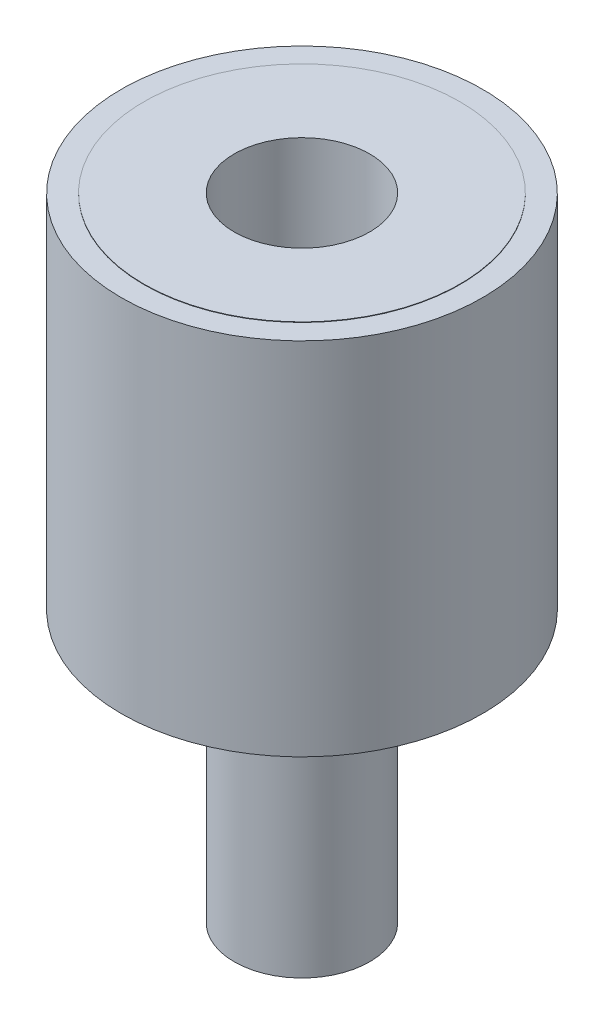
ISO-10303-21;
HEADER;
FILE_DESCRIPTION(('STEP AP214'),'2;1');
FILE_NAME('part.step','',(''),(''),'','','');
FILE_SCHEMA(('AUTOMOTIVE_DESIGN { 1 0 10303 214 1 1 1 1 }'));
ENDSEC;
DATA;
#1=APPLICATION_CONTEXT('core data for automotive mechanical design processes');
#2=APPLICATION_PROTOCOL_DEFINITION('international standard','automotive_design',2000,#1);
#3=PRODUCT_CONTEXT('',#1,'mechanical');
#4=PRODUCT('Part','Part','',(#3));
#5=PRODUCT_RELATED_PRODUCT_CATEGORY('part','',(#4));
#6=PRODUCT_DEFINITION_FORMATION('','',#4);
#7=PRODUCT_DEFINITION_CONTEXT('part definition',#1,'design');
#8=PRODUCT_DEFINITION('design','',#6,#7);
#9=PRODUCT_DEFINITION_SHAPE('','',#8);
#10=(LENGTH_UNIT() NAMED_UNIT(*) SI_UNIT(.MILLI.,.METRE.));
#11=(NAMED_UNIT(*) PLANE_ANGLE_UNIT() SI_UNIT($,.RADIAN.));
#12=(NAMED_UNIT(*) SI_UNIT($,.STERADIAN.) SOLID_ANGLE_UNIT());
#13=UNCERTAINTY_MEASURE_WITH_UNIT(LENGTH_MEASURE(1.E-05),#10,'distance_accuracy_value','');
#14=(GEOMETRIC_REPRESENTATION_CONTEXT(3) GLOBAL_UNCERTAINTY_ASSIGNED_CONTEXT((#13)) GLOBAL_UNIT_ASSIGNED_CONTEXT((#10,
#11,#12)) REPRESENTATION_CONTEXT('',''));
#15=CARTESIAN_POINT('',(0.,0.,0.));
#16=DIRECTION('',(0.,0.,1.));
#17=DIRECTION('',(1.,0.,0.));
#18=AXIS2_PLACEMENT_3D('',#15,#16,#17);
#19=CARTESIAN_POINT('',(0.,-5.5,0.));
#20=DIRECTION('',(0.,-1.,0.));
#21=DIRECTION('',(0.,0.,-1.));
#22=AXIS2_PLACEMENT_3D('',#19,#20,#21);
#23=PLANE('',#22);
#24=CARTESIAN_POINT('',(0.,-5.5,0.));
#25=DIRECTION('',(0.,1.,0.));
#26=DIRECTION('',(0.,0.,1.));
#27=AXIS2_PLACEMENT_3D('',#24,#25,#26);
#28=CIRCLE('',#27,1.5);
#29=CARTESIAN_POINT('',(0.,-5.5,1.5));
#30=VERTEX_POINT('',#29);
#31=EDGE_CURVE('E10',#30,#30,#28,.T.);
#32=ORIENTED_EDGE('',*,*,#31,.F.);
#33=EDGE_LOOP('',(#32));
#34=FACE_BOUND('',#33,.T.);
#35=ADVANCED_FACE('F35',(#34),#23,.T.);
#36=CARTESIAN_POINT('',(0.,5.5,0.));
#37=DIRECTION('',(0.,1.,0.));
#38=DIRECTION('',(0.,0.,1.));
#39=AXIS2_PLACEMENT_3D('',#36,#37,#38);
#40=CYLINDRICAL_SURFACE('',#39,1.5);
#41=ORIENTED_EDGE('',*,*,#31,.T.);
#42=EDGE_LOOP('',(#41));
#43=FACE_BOUND('',#42,.T.);
#44=CARTESIAN_POINT('',(0.,0.5,0.));
#45=DIRECTION('',(0.,1.,0.));
#46=DIRECTION('',(0.,0.,1.));
#47=AXIS2_PLACEMENT_3D('',#44,#45,#46);
#48=CIRCLE('',#47,1.5);
#49=CARTESIAN_POINT('',(0.,0.5,1.5));
#50=VERTEX_POINT('',#49);
#51=EDGE_CURVE('E41',#50,#50,#48,.T.);
#52=ORIENTED_EDGE('',*,*,#51,.F.);
#53=EDGE_LOOP('',(#52));
#54=FACE_BOUND('',#53,.T.);
#55=ADVANCED_FACE('F89',(#43,#54),#40,.T.);
#56=CARTESIAN_POINT('',(-1.5,0.5,0.));
#57=DIRECTION('',(0.,-1.,0.));
#58=DIRECTION('',(0.,0.,-1.));
#59=AXIS2_PLACEMENT_3D('',#56,#57,#58);
#60=PLANE('',#59);
#61=ORIENTED_EDGE('',*,*,#51,.T.);
#62=EDGE_LOOP('',(#61));
#63=FACE_BOUND('',#62,.T.);
#64=CARTESIAN_POINT('',(0.,0.5,0.));
#65=DIRECTION('',(0.,1.,0.));
#66=DIRECTION('',(0.,0.,1.));
#67=AXIS2_PLACEMENT_3D('',#64,#65,#66);
#68=CIRCLE('',#67,3.5);
#69=CARTESIAN_POINT('',(0.,0.5,3.5));
#70=VERTEX_POINT('',#69);
#71=EDGE_CURVE('E45',#70,#70,#68,.T.);
#72=ORIENTED_EDGE('',*,*,#71,.F.);
#73=EDGE_LOOP('',(#72));
#74=FACE_BOUND('',#73,.T.);
#75=ADVANCED_FACE('F94',(#63,#74),#60,.T.);
#76=CARTESIAN_POINT('',(0.,5.5,0.));
#77=DIRECTION('',(0.,1.,0.));
#78=DIRECTION('',(0.,0.,1.));
#79=AXIS2_PLACEMENT_3D('',#76,#77,#78);
#80=CYLINDRICAL_SURFACE('',#79,3.5);
#81=ORIENTED_EDGE('',*,*,#71,.T.);
#82=EDGE_LOOP('',(#81));
#83=FACE_BOUND('',#82,.T.);
#84=CARTESIAN_POINT('',(0.,0.509999999999999,0.));
#85=DIRECTION('',(0.,1.,0.));
#86=DIRECTION('',(0.,0.,1.));
#87=AXIS2_PLACEMENT_3D('',#84,#85,#86);
#88=CIRCLE('',#87,3.5);
#89=CARTESIAN_POINT('',(0.,0.509999999999999,3.5));
#90=VERTEX_POINT('',#89);
#91=EDGE_CURVE('E49',#90,#90,#88,.T.);
#92=ORIENTED_EDGE('',*,*,#91,.F.);
#93=EDGE_LOOP('',(#92));
#94=FACE_BOUND('',#93,.T.);
#95=ADVANCED_FACE('F98',(#83,#94),#80,.T.);
#96=CARTESIAN_POINT('',(-3.5,0.509999999999999,0.));
#97=DIRECTION('',(0.,-1.,0.));
#98=DIRECTION('',(0.,0.,-1.));
#99=AXIS2_PLACEMENT_3D('',#96,#97,#98);
#100=PLANE('',#99);
#101=ORIENTED_EDGE('',*,*,#91,.T.);
#102=EDGE_LOOP('',(#101));
#103=FACE_BOUND('',#102,.T.);
#104=CARTESIAN_POINT('',(0.,0.509999999999999,0.));
#105=DIRECTION('',(0.,1.,0.));
#106=DIRECTION('',(0.,0.,1.));
#107=AXIS2_PLACEMENT_3D('',#104,#105,#106);
#108=CIRCLE('',#107,4.);
#109=CARTESIAN_POINT('',(0.,0.509999999999999,4.));
#110=VERTEX_POINT('',#109);
#111=EDGE_CURVE('E54',#110,#110,#108,.T.);
#112=ORIENTED_EDGE('',*,*,#111,.F.);
#113=EDGE_LOOP('',(#112));
#114=FACE_BOUND('',#113,.T.);
#115=ADVANCED_FACE('F104',(#103,#114),#100,.T.);
#116=CARTESIAN_POINT('',(0.,5.5,0.));
#117=DIRECTION('',(0.,1.,0.));
#118=DIRECTION('',(0.,0.,1.));
#119=AXIS2_PLACEMENT_3D('',#116,#117,#118);
#120=CYLINDRICAL_SURFACE('',#119,4.);
#121=ORIENTED_EDGE('',*,*,#111,.T.);
#122=EDGE_LOOP('',(#121));
#123=FACE_BOUND('',#122,.T.);
#124=CARTESIAN_POINT('',(0.,8.49,0.));
#125=DIRECTION('',(0.,1.,0.));
#126=DIRECTION('',(0.,0.,1.));
#127=AXIS2_PLACEMENT_3D('',#124,#125,#126);
#128=CIRCLE('',#127,4.);
#129=CARTESIAN_POINT('',(0.,8.49,4.));
#130=VERTEX_POINT('',#129);
#131=EDGE_CURVE('E57',#130,#130,#128,.T.);
#132=ORIENTED_EDGE('',*,*,#131,.F.);
#133=EDGE_LOOP('',(#132));
#134=FACE_BOUND('',#133,.T.);
#135=ADVANCED_FACE('F108',(#123,#134),#120,.T.);
#136=CARTESIAN_POINT('',(-4.,8.49,0.));
#137=DIRECTION('',(0.,1.,0.));
#138=DIRECTION('',(0.,0.,1.));
#139=AXIS2_PLACEMENT_3D('',#136,#137,#138);
#140=PLANE('',#139);
#141=ORIENTED_EDGE('',*,*,#131,.T.);
#142=EDGE_LOOP('',(#141));
#143=FACE_BOUND('',#142,.T.);
#144=CARTESIAN_POINT('',(0.,8.49,0.));
#145=DIRECTION('',(0.,1.,0.));
#146=DIRECTION('',(0.,0.,1.));
#147=AXIS2_PLACEMENT_3D('',#144,#145,#146);
#148=CIRCLE('',#147,3.5);
#149=CARTESIAN_POINT('',(0.,8.49,3.5));
#150=VERTEX_POINT('',#149);
#151=EDGE_CURVE('E60',#150,#150,#148,.T.);
#152=ORIENTED_EDGE('',*,*,#151,.F.);
#153=EDGE_LOOP('',(#152));
#154=FACE_BOUND('',#153,.T.);
#155=ADVANCED_FACE('F112',(#143,#154),#140,.T.);
#156=CARTESIAN_POINT('',(0.,5.5,0.));
#157=DIRECTION('',(0.,1.,0.));
#158=DIRECTION('',(0.,0.,1.));
#159=AXIS2_PLACEMENT_3D('',#156,#157,#158);
#160=CYLINDRICAL_SURFACE('',#159,3.5);
#161=ORIENTED_EDGE('',*,*,#151,.T.);
#162=EDGE_LOOP('',(#161));
#163=FACE_BOUND('',#162,.T.);
#164=CARTESIAN_POINT('',(0.,8.5,0.));
#165=DIRECTION('',(0.,1.,0.));
#166=DIRECTION('',(0.,0.,1.));
#167=AXIS2_PLACEMENT_3D('',#164,#165,#166);
#168=CIRCLE('',#167,3.5);
#169=CARTESIAN_POINT('',(0.,8.5,3.5));
#170=VERTEX_POINT('',#169);
#171=EDGE_CURVE('E63',#170,#170,#168,.T.);
#172=ORIENTED_EDGE('',*,*,#171,.F.);
#173=EDGE_LOOP('',(#172));
#174=FACE_BOUND('',#173,.T.);
#175=ADVANCED_FACE('F85',(#163,#174),#160,.T.);
#176=CARTESIAN_POINT('',(-3.5,8.5,0.));
#177=DIRECTION('',(0.,1.,0.));
#178=DIRECTION('',(0.,0.,1.));
#179=AXIS2_PLACEMENT_3D('',#176,#177,#178);
#180=PLANE('',#179);
#181=ORIENTED_EDGE('',*,*,#171,.T.);
#182=EDGE_LOOP('',(#181));
#183=FACE_BOUND('',#182,.T.);
#184=CARTESIAN_POINT('',(0.,8.5,0.));
#185=DIRECTION('',(0.,1.,0.));
#186=DIRECTION('',(0.,0.,1.));
#187=AXIS2_PLACEMENT_3D('',#184,#185,#186);
#188=CIRCLE('',#187,1.5);
#189=CARTESIAN_POINT('',(0.,8.5,1.5));
#190=VERTEX_POINT('',#189);
#191=EDGE_CURVE('E66',#190,#190,#188,.T.);
#192=ORIENTED_EDGE('',*,*,#191,.F.);
#193=EDGE_LOOP('',(#192));
#194=FACE_BOUND('',#193,.T.);
#195=ADVANCED_FACE('F77',(#183,#194),#180,.T.);
#196=CARTESIAN_POINT('',(0.,5.5,0.));
#197=DIRECTION('',(0.,1.,0.));
#198=DIRECTION('',(0.,0.,1.));
#199=AXIS2_PLACEMENT_3D('',#196,#197,#198);
#200=CYLINDRICAL_SURFACE('',#199,1.5);
#201=ORIENTED_EDGE('',*,*,#191,.T.);
#202=EDGE_LOOP('',(#201));
#203=FACE_BOUND('',#202,.T.);
#204=CARTESIAN_POINT('',(0.,5.5,0.));
#205=DIRECTION('',(0.,1.,0.));
#206=DIRECTION('',(0.,0.,1.));
#207=AXIS2_PLACEMENT_3D('',#204,#205,#206);
#208=CIRCLE('',#207,1.5);
#209=CARTESIAN_POINT('',(0.,5.5,1.5));
#210=VERTEX_POINT('',#209);
#211=EDGE_CURVE('E69',#210,#210,#208,.T.);
#212=ORIENTED_EDGE('',*,*,#211,.F.);
#213=EDGE_LOOP('',(#212));
#214=FACE_BOUND('',#213,.T.);
#215=ADVANCED_FACE('F75',(#203,#214),#200,.F.);
#216=CARTESIAN_POINT('',(-1.5,5.5,0.));
#217=DIRECTION('',(0.,1.,0.));
#218=DIRECTION('',(0.,0.,1.));
#219=AXIS2_PLACEMENT_3D('',#216,#217,#218);
#220=PLANE('',#219);
#221=ORIENTED_EDGE('',*,*,#211,.T.);
#222=EDGE_LOOP('',(#221));
#223=FACE_BOUND('',#222,.T.);
#224=ADVANCED_FACE('F73',(#223),#220,.T.);
#225=CLOSED_SHELL('',(#35,#55,#75,#95,#115,#135,#155,#175,#195,#215,#224));
#226=MANIFOLD_SOLID_BREP('B2',#225);
#227=ADVANCED_BREP_SHAPE_REPRESENTATION('',(#18,#226),#14);
#228=SHAPE_DEFINITION_REPRESENTATION(#9,#227);
ENDSEC;
END-ISO-10303-21;
